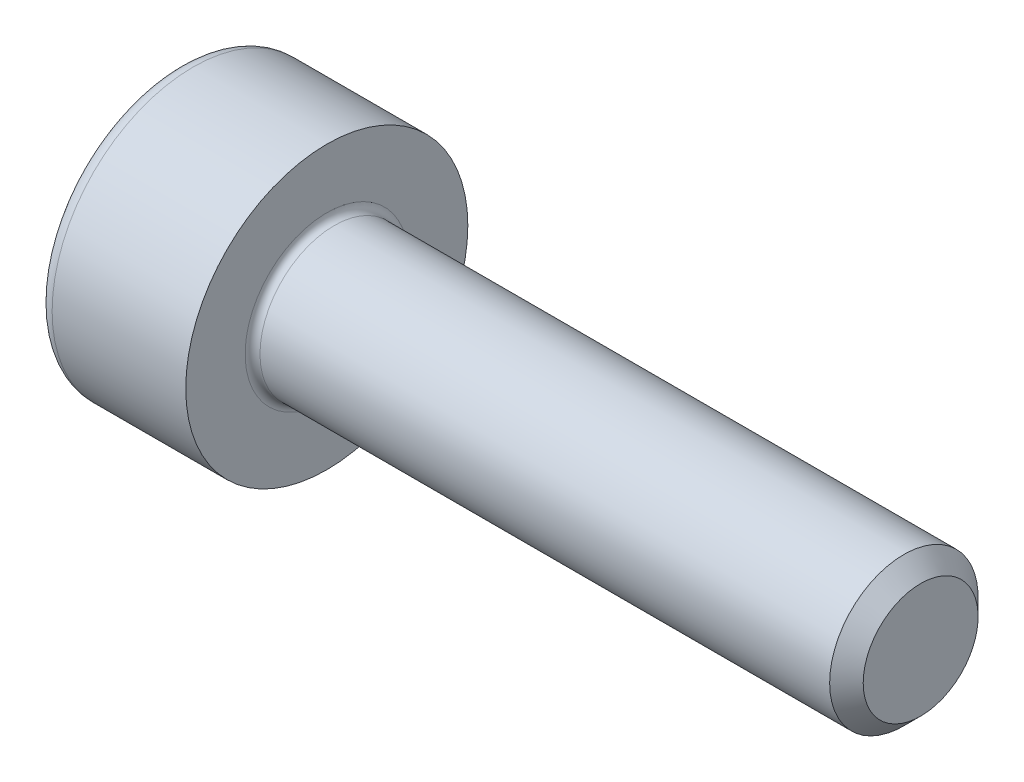
ISO-10303-21;
HEADER;
FILE_DESCRIPTION(('STEP AP214'),'2;1');
FILE_NAME('part.step','',(''),(''),'','','');
FILE_SCHEMA(('AUTOMOTIVE_DESIGN { 1 0 10303 214 1 1 1 1 }'));
ENDSEC;
DATA;
#1=APPLICATION_CONTEXT('core data for automotive mechanical design processes');
#2=APPLICATION_PROTOCOL_DEFINITION('international standard','automotive_design',2000,#1);
#3=PRODUCT_CONTEXT('',#1,'mechanical');
#4=PRODUCT('Part','Part','',(#3));
#5=PRODUCT_RELATED_PRODUCT_CATEGORY('part','',(#4));
#6=PRODUCT_DEFINITION_FORMATION('','',#4);
#7=PRODUCT_DEFINITION_CONTEXT('part definition',#1,'design');
#8=PRODUCT_DEFINITION('design','',#6,#7);
#9=PRODUCT_DEFINITION_SHAPE('','',#8);
#10=(LENGTH_UNIT() NAMED_UNIT(*) SI_UNIT(.MILLI.,.METRE.));
#11=(NAMED_UNIT(*) PLANE_ANGLE_UNIT() SI_UNIT($,.RADIAN.));
#12=(NAMED_UNIT(*) SI_UNIT($,.STERADIAN.) SOLID_ANGLE_UNIT());
#13=UNCERTAINTY_MEASURE_WITH_UNIT(LENGTH_MEASURE(1.E-05),#10,'distance_accuracy_value','');
#14=(GEOMETRIC_REPRESENTATION_CONTEXT(3) GLOBAL_UNCERTAINTY_ASSIGNED_CONTEXT((#13)) GLOBAL_UNIT_ASSIGNED_CONTEXT((#10,
#11,#12)) REPRESENTATION_CONTEXT('',''));
#15=CARTESIAN_POINT('',(0.,0.,0.));
#16=DIRECTION('',(0.,0.,1.));
#17=DIRECTION('',(1.,0.,0.));
#18=AXIS2_PLACEMENT_3D('',#15,#16,#17);
#19=CARTESIAN_POINT('',(0.,0.,0.));
#20=DIRECTION('',(-1.,0.,0.));
#21=DIRECTION('',(0.,0.,1.));
#22=AXIS2_PLACEMENT_3D('',#19,#20,#21);
#23=PLANE('',#22);
#24=DIRECTION('',(0.,-0.499999999999999,0.866025403784439));
#25=VECTOR('',#24,1.);
#26=CARTESIAN_POINT('',(0.,0.877572409168226,0.));
#27=LINE('',#26,#25);
#28=CARTESIAN_POINT('',(0.,0.877572409168226,0.));
#29=VERTEX_POINT('',#28);
#30=CARTESIAN_POINT('',(0.,0.438786204584111,0.759999999999997));
#31=VERTEX_POINT('',#30);
#32=EDGE_CURVE('E265',#29,#31,#27,.T.);
#33=ORIENTED_EDGE('',*,*,#32,.T.);
#34=DIRECTION('',(0.,1.,0.));
#35=VECTOR('',#34,1.);
#36=CARTESIAN_POINT('',(0.,-0.438786204584119,0.759999999999998));
#37=LINE('',#36,#35);
#38=CARTESIAN_POINT('',(0.,-0.438786204584119,0.759999999999998));
#39=VERTEX_POINT('',#38);
#40=EDGE_CURVE('E126',#39,#31,#37,.T.);
#41=ORIENTED_EDGE('',*,*,#40,.F.);
#42=DIRECTION('',(0.,-0.500000000000001,-0.866025403784438));
#43=VECTOR('',#42,1.);
#44=CARTESIAN_POINT('',(0.,-0.438786204584119,0.759999999999998));
#45=LINE('',#44,#43);
#46=CARTESIAN_POINT('',(0.,-0.877572409168236,0.));
#47=VERTEX_POINT('',#46);
#48=EDGE_CURVE('E268',#39,#47,#45,.T.);
#49=ORIENTED_EDGE('',*,*,#48,.T.);
#50=DIRECTION('',(0.,0.499999999999999,-0.866025403784439));
#51=VECTOR('',#50,1.);
#52=CARTESIAN_POINT('',(0.,-0.877572409168236,0.));
#53=LINE('',#52,#51);
#54=CARTESIAN_POINT('',(0.,-0.438786204584121,-0.760000000000002));
#55=VERTEX_POINT('',#54);
#56=EDGE_CURVE('E271',#47,#55,#53,.T.);
#57=ORIENTED_EDGE('',*,*,#56,.T.);
#58=DIRECTION('',(0.,-1.,0.));
#59=VECTOR('',#58,1.);
#60=CARTESIAN_POINT('',(0.,0.438786204584109,-0.760000000000003));
#61=LINE('',#60,#59);
#62=CARTESIAN_POINT('',(0.,0.438786204584109,-0.760000000000003));
#63=VERTEX_POINT('',#62);
#64=EDGE_CURVE('E274',#63,#55,#61,.T.);
#65=ORIENTED_EDGE('',*,*,#64,.F.);
#66=DIRECTION('',(0.,-0.500000000000001,-0.866025403784438));
#67=VECTOR('',#66,1.);
#68=CARTESIAN_POINT('',(0.,0.877572409168226,0.));
#69=LINE('',#68,#67);
#70=EDGE_CURVE('E121',#29,#63,#69,.T.);
#71=ORIENTED_EDGE('',*,*,#70,.F.);
#72=EDGE_LOOP('',(#33,#41,#49,#57,#65,#71));
#73=FACE_BOUND('',#72,.T.);
#74=CARTESIAN_POINT('',(0.,0.,0.));
#75=DIRECTION('',(-1.,0.,0.));
#76=DIRECTION('',(0.,0.,1.));
#77=AXIS2_PLACEMENT_3D('',#74,#75,#76);
#78=CIRCLE('',#77,1.7);
#79=CARTESIAN_POINT('',(0.,0.,1.7));
#80=VERTEX_POINT('',#79);
#81=EDGE_CURVE('E42',#80,#80,#78,.T.);
#82=ORIENTED_EDGE('',*,*,#81,.T.);
#83=EDGE_LOOP('',(#82));
#84=FACE_BOUND('',#83,.T.);
#85=ADVANCED_FACE('F34',(#73,#84),#23,.T.);
#86=CARTESIAN_POINT('',(-31.75,0.,0.));
#87=DIRECTION('',(-1.,0.,0.));
#88=DIRECTION('',(0.,0.,1.));
#89=AXIS2_PLACEMENT_3D('',#86,#87,#88);
#90=CYLINDRICAL_SURFACE('',#89,1.9);
#91=CARTESIAN_POINT('',(0.199999999999999,0.,0.));
#92=DIRECTION('',(-1.,0.,0.));
#93=DIRECTION('',(0.,0.,1.));
#94=AXIS2_PLACEMENT_3D('',#91,#92,#93);
#95=CIRCLE('',#94,1.9);
#96=CARTESIAN_POINT('',(0.199999999999999,0.,1.9));
#97=VERTEX_POINT('',#96);
#98=EDGE_CURVE('E11',#97,#97,#95,.F.);
#99=ORIENTED_EDGE('',*,*,#98,.T.);
#100=EDGE_LOOP('',(#99));
#101=FACE_BOUND('',#100,.T.);
#102=CARTESIAN_POINT('',(2.,0.,0.));
#103=DIRECTION('',(-1.,0.,0.));
#104=DIRECTION('',(0.,0.,1.));
#105=AXIS2_PLACEMENT_3D('',#102,#103,#104);
#106=CIRCLE('',#105,1.9);
#107=CARTESIAN_POINT('',(2.,0.,1.9));
#108=VERTEX_POINT('',#107);
#109=EDGE_CURVE('E144',#108,#108,#106,.T.);
#110=ORIENTED_EDGE('',*,*,#109,.T.);
#111=EDGE_LOOP('',(#110));
#112=FACE_BOUND('',#111,.T.);
#113=ADVANCED_FACE('F168',(#101,#112),#90,.T.);
#114=CARTESIAN_POINT('',(2.,1.9,0.));
#115=DIRECTION('',(1.,0.,0.));
#116=DIRECTION('',(0.,0.,-1.));
#117=AXIS2_PLACEMENT_3D('',#114,#115,#116);
#118=PLANE('',#117);
#119=CARTESIAN_POINT('',(2.,0.,0.));
#120=DIRECTION('',(1.,0.,0.));
#121=DIRECTION('',(0.,0.,-1.));
#122=AXIS2_PLACEMENT_3D('',#119,#120,#121);
#123=CIRCLE('',#122,1.1);
#124=CARTESIAN_POINT('',(2.,0.,-1.1));
#125=VERTEX_POINT('',#124);
#126=EDGE_CURVE('E147',#125,#125,#123,.F.);
#127=ORIENTED_EDGE('',*,*,#126,.T.);
#128=EDGE_LOOP('',(#127));
#129=FACE_BOUND('',#128,.T.);
#130=ORIENTED_EDGE('',*,*,#109,.F.);
#131=EDGE_LOOP('',(#130));
#132=FACE_BOUND('',#131,.T.);
#133=ADVANCED_FACE('F174',(#129,#132),#118,.T.);
#134=CARTESIAN_POINT('',(-31.75,0.,0.));
#135=DIRECTION('',(-1.,0.,0.));
#136=DIRECTION('',(0.,0.,1.));
#137=AXIS2_PLACEMENT_3D('',#134,#135,#136);
#138=CYLINDRICAL_SURFACE('',#137,1.);
#139=CARTESIAN_POINT('',(2.1,0.,0.));
#140=DIRECTION('',(1.,0.,0.));
#141=DIRECTION('',(0.,0.,-1.));
#142=AXIS2_PLACEMENT_3D('',#139,#140,#141);
#143=CIRCLE('',#142,1.);
#144=CARTESIAN_POINT('',(2.1,0.,-1.));
#145=VERTEX_POINT('',#144);
#146=EDGE_CURVE('E150',#145,#145,#143,.T.);
#147=ORIENTED_EDGE('',*,*,#146,.T.);
#148=EDGE_LOOP('',(#147));
#149=FACE_BOUND('',#148,.T.);
#150=CARTESIAN_POINT('',(9.774,0.,0.));
#151=DIRECTION('',(-1.,0.,0.));
#152=DIRECTION('',(0.,0.,1.));
#153=AXIS2_PLACEMENT_3D('',#150,#151,#152);
#154=CIRCLE('',#153,1.);
#155=CARTESIAN_POINT('',(9.774,0.,1.));
#156=VERTEX_POINT('',#155);
#157=EDGE_CURVE('E141',#156,#156,#154,.T.);
#158=ORIENTED_EDGE('',*,*,#157,.T.);
#159=EDGE_LOOP('',(#158));
#160=FACE_BOUND('',#159,.T.);
#161=ADVANCED_FACE('F180',(#149,#160),#138,.T.);
#162=CARTESIAN_POINT('',(10.,0.,0.));
#163=DIRECTION('',(-1.,0.,0.));
#164=DIRECTION('',(0.,0.,1.));
#165=AXIS2_PLACEMENT_3D('',#162,#163,#164);
#166=CONICAL_SURFACE('',#165,0.774,0.785398163397454);
#167=ORIENTED_EDGE('',*,*,#157,.F.);
#168=EDGE_LOOP('',(#167));
#169=FACE_BOUND('',#168,.T.);
#170=CARTESIAN_POINT('',(10.,0.,0.));
#171=DIRECTION('',(-1.,0.,0.));
#172=DIRECTION('',(0.,0.,1.));
#173=AXIS2_PLACEMENT_3D('',#170,#171,#172);
#174=CIRCLE('',#173,0.774);
#175=CARTESIAN_POINT('',(10.,0.,0.774));
#176=VERTEX_POINT('',#175);
#177=EDGE_CURVE('E137',#176,#176,#174,.T.);
#178=ORIENTED_EDGE('',*,*,#177,.T.);
#179=EDGE_LOOP('',(#178));
#180=FACE_BOUND('',#179,.T.);
#181=ADVANCED_FACE('F184',(#169,#180),#166,.T.);
#182=CARTESIAN_POINT('',(10.,0.774,0.));
#183=DIRECTION('',(1.,0.,0.));
#184=DIRECTION('',(0.,0.,-1.));
#185=AXIS2_PLACEMENT_3D('',#182,#183,#184);
#186=PLANE('',#185);
#187=ORIENTED_EDGE('',*,*,#177,.F.);
#188=EDGE_LOOP('',(#187));
#189=FACE_BOUND('',#188,.T.);
#190=ADVANCED_FACE('F164',(#189),#186,.T.);
#191=CARTESIAN_POINT('',(2.1,0.,0.));
#192=DIRECTION('',(1.,0.,0.));
#193=DIRECTION('',(0.,0.,-1.));
#194=AXIS2_PLACEMENT_3D('',#191,#192,#193);
#195=TOROIDAL_SURFACE('',#194,1.1,0.1);
#196=ORIENTED_EDGE('',*,*,#146,.F.);
#197=EDGE_LOOP('',(#196));
#198=FACE_BOUND('',#197,.T.);
#199=ORIENTED_EDGE('',*,*,#126,.F.);
#200=EDGE_LOOP('',(#199));
#201=FACE_BOUND('',#200,.T.);
#202=ADVANCED_FACE('F157',(#198,#201),#195,.F.);
#203=CARTESIAN_POINT('',(0.199999999999999,0.,0.));
#204=DIRECTION('',(-1.,0.,0.));
#205=DIRECTION('',(0.,0.,1.));
#206=AXIS2_PLACEMENT_3D('',#203,#204,#205);
#207=TOROIDAL_SURFACE('',#206,1.7,0.2);
#208=ORIENTED_EDGE('',*,*,#98,.F.);
#209=EDGE_LOOP('',(#208));
#210=FACE_BOUND('',#209,.T.);
#211=ORIENTED_EDGE('',*,*,#81,.F.);
#212=EDGE_LOOP('',(#211));
#213=FACE_BOUND('',#212,.T.);
#214=ADVANCED_FACE('F36',(#210,#213),#207,.T.);
#215=CARTESIAN_POINT('',(1.,0.877572409168226,0.));
#216=DIRECTION('',(0.,-0.866025403784439,-0.499999999999999));
#217=DIRECTION('',(0.,0.499999999999999,-0.866025403784439));
#218=AXIS2_PLACEMENT_3D('',#215,#216,#217);
#219=PLANE('',#218);
#220=ORIENTED_EDGE('',*,*,#32,.F.);
#221=DIRECTION('',(-1.,0.,0.));
#222=VECTOR('',#221,1.);
#223=CARTESIAN_POINT('',(1.,0.877572409168226,0.));
#224=LINE('',#223,#222);
#225=CARTESIAN_POINT('',(1.,0.877572409168226,0.));
#226=VERTEX_POINT('',#225);
#227=EDGE_CURVE('E264',#226,#29,#224,.T.);
#228=ORIENTED_EDGE('',*,*,#227,.F.);
#229=DIRECTION('',(0.,-0.499999999999999,0.866025403784439));
#230=VECTOR('',#229,1.);
#231=CARTESIAN_POINT('',(1.,0.877572409168226,0.));
#232=LINE('',#231,#230);
#233=CARTESIAN_POINT('',(1.,0.658179306876174,0.379999999999999));
#234=VERTEX_POINT('',#233);
#235=EDGE_CURVE('E49',#226,#234,#232,.T.);
#236=ORIENTED_EDGE('',*,*,#235,.T.);
#237=CARTESIAN_POINT('',(1.,0.438786204584111,0.759999999999997));
#238=VERTEX_POINT('',#237);
#239=EDGE_CURVE('E107',#234,#238,#232,.T.);
#240=ORIENTED_EDGE('',*,*,#239,.T.);
#241=DIRECTION('',(-1.,0.,0.));
#242=VECTOR('',#241,1.);
#243=CARTESIAN_POINT('',(1.,0.438786204584111,0.759999999999997));
#244=LINE('',#243,#242);
#245=EDGE_CURVE('E119',#238,#31,#244,.T.);
#246=ORIENTED_EDGE('',*,*,#245,.T.);
#247=EDGE_LOOP('',(#220,#228,#236,#240,#246));
#248=FACE_BOUND('',#247,.T.);
#249=ADVANCED_FACE('F118',(#248),#219,.T.);
#250=CARTESIAN_POINT('',(1.,-0.438786204584119,0.759999999999998));
#251=DIRECTION('',(0.,0.,1.));
#252=DIRECTION('',(0.,-1.,0.));
#253=AXIS2_PLACEMENT_3D('',#250,#251,#252);
#254=PLANE('',#253);
#255=ORIENTED_EDGE('',*,*,#40,.T.);
#256=ORIENTED_EDGE('',*,*,#245,.F.);
#257=DIRECTION('',(0.,1.,0.));
#258=VECTOR('',#257,1.);
#259=CARTESIAN_POINT('',(1.,-0.438786204584119,0.759999999999998));
#260=LINE('',#259,#258);
#261=CARTESIAN_POINT('',(1.,0.,0.759999999999997));
#262=VERTEX_POINT('',#261);
#263=EDGE_CURVE('E105',#262,#238,#260,.T.);
#264=ORIENTED_EDGE('',*,*,#263,.F.);
#265=CARTESIAN_POINT('',(1.,-0.438786204584119,0.759999999999998));
#266=VERTEX_POINT('',#265);
#267=EDGE_CURVE('E115',#266,#262,#260,.T.);
#268=ORIENTED_EDGE('',*,*,#267,.F.);
#269=DIRECTION('',(-1.,0.,0.));
#270=VECTOR('',#269,1.);
#271=CARTESIAN_POINT('',(1.,-0.438786204584119,0.759999999999998));
#272=LINE('',#271,#270);
#273=EDGE_CURVE('E128',#266,#39,#272,.T.);
#274=ORIENTED_EDGE('',*,*,#273,.T.);
#275=EDGE_LOOP('',(#255,#256,#264,#268,#274));
#276=FACE_BOUND('',#275,.T.);
#277=ADVANCED_FACE('F123',(#276),#254,.F.);
#278=CARTESIAN_POINT('',(1.,-0.438786204584119,0.759999999999998));
#279=DIRECTION('',(0.,0.866025403784438,-0.500000000000001));
#280=DIRECTION('',(0.,0.500000000000001,0.866025403784438));
#281=AXIS2_PLACEMENT_3D('',#278,#279,#280);
#282=PLANE('',#281);
#283=ORIENTED_EDGE('',*,*,#48,.F.);
#284=ORIENTED_EDGE('',*,*,#273,.F.);
#285=DIRECTION('',(0.,-0.500000000000001,-0.866025403784438));
#286=VECTOR('',#285,1.);
#287=CARTESIAN_POINT('',(1.,-0.438786204584119,0.759999999999998));
#288=LINE('',#287,#286);
#289=CARTESIAN_POINT('',(1.,-0.658179306876175,0.380000000000002));
#290=VERTEX_POINT('',#289);
#291=EDGE_CURVE('E245',#266,#290,#288,.T.);
#292=ORIENTED_EDGE('',*,*,#291,.T.);
#293=CARTESIAN_POINT('',(1.,-0.877572409168236,0.));
#294=VERTEX_POINT('',#293);
#295=EDGE_CURVE('E247',#290,#294,#288,.T.);
#296=ORIENTED_EDGE('',*,*,#295,.T.);
#297=DIRECTION('',(-1.,0.,0.));
#298=VECTOR('',#297,1.);
#299=CARTESIAN_POINT('',(1.,-0.877572409168236,0.));
#300=LINE('',#299,#298);
#301=EDGE_CURVE('E133',#294,#47,#300,.T.);
#302=ORIENTED_EDGE('',*,*,#301,.T.);
#303=EDGE_LOOP('',(#283,#284,#292,#296,#302));
#304=FACE_BOUND('',#303,.T.);
#305=ADVANCED_FACE('F197',(#304),#282,.T.);
#306=CARTESIAN_POINT('',(1.,-0.877572409168236,0.));
#307=DIRECTION('',(0.,0.866025403784439,0.499999999999999));
#308=DIRECTION('',(0.,-0.499999999999999,0.866025403784439));
#309=AXIS2_PLACEMENT_3D('',#306,#307,#308);
#310=PLANE('',#309);
#311=ORIENTED_EDGE('',*,*,#56,.F.);
#312=ORIENTED_EDGE('',*,*,#301,.F.);
#313=DIRECTION('',(0.,0.499999999999999,-0.866025403784439));
#314=VECTOR('',#313,1.);
#315=CARTESIAN_POINT('',(1.,-0.877572409168236,0.));
#316=LINE('',#315,#314);
#317=CARTESIAN_POINT('',(1.,-0.658179306876178,-0.380000000000001));
#318=VERTEX_POINT('',#317);
#319=EDGE_CURVE('E250',#294,#318,#316,.T.);
#320=ORIENTED_EDGE('',*,*,#319,.T.);
#321=CARTESIAN_POINT('',(1.,-0.438786204584121,-0.760000000000002));
#322=VERTEX_POINT('',#321);
#323=EDGE_CURVE('E254',#318,#322,#316,.T.);
#324=ORIENTED_EDGE('',*,*,#323,.T.);
#325=DIRECTION('',(-1.,0.,0.));
#326=VECTOR('',#325,1.);
#327=CARTESIAN_POINT('',(1.,-0.438786204584121,-0.760000000000002));
#328=LINE('',#327,#326);
#329=EDGE_CURVE('E283',#322,#55,#328,.T.);
#330=ORIENTED_EDGE('',*,*,#329,.T.);
#331=EDGE_LOOP('',(#311,#312,#320,#324,#330));
#332=FACE_BOUND('',#331,.T.);
#333=ADVANCED_FACE('F200',(#332),#310,.T.);
#334=CARTESIAN_POINT('',(1.,0.438786204584109,-0.760000000000003));
#335=DIRECTION('',(0.,0.,-1.));
#336=DIRECTION('',(0.,1.,0.));
#337=AXIS2_PLACEMENT_3D('',#334,#335,#336);
#338=PLANE('',#337);
#339=ORIENTED_EDGE('',*,*,#64,.T.);
#340=ORIENTED_EDGE('',*,*,#329,.F.);
#341=DIRECTION('',(0.,-1.,0.));
#342=VECTOR('',#341,1.);
#343=CARTESIAN_POINT('',(1.,0.438786204584109,-0.760000000000003));
#344=LINE('',#343,#342);
#345=CARTESIAN_POINT('',(1.,0.,-0.760000000000002));
#346=VERTEX_POINT('',#345);
#347=EDGE_CURVE('E258',#346,#322,#344,.T.);
#348=ORIENTED_EDGE('',*,*,#347,.F.);
#349=CARTESIAN_POINT('',(1.,0.438786204584109,-0.760000000000003));
#350=VERTEX_POINT('',#349);
#351=EDGE_CURVE('E259',#350,#346,#344,.T.);
#352=ORIENTED_EDGE('',*,*,#351,.F.);
#353=DIRECTION('',(-1.,0.,0.));
#354=VECTOR('',#353,1.);
#355=CARTESIAN_POINT('',(1.,0.438786204584109,-0.760000000000003));
#356=LINE('',#355,#354);
#357=EDGE_CURVE('E280',#350,#63,#356,.T.);
#358=ORIENTED_EDGE('',*,*,#357,.T.);
#359=EDGE_LOOP('',(#339,#340,#348,#352,#358));
#360=FACE_BOUND('',#359,.T.);
#361=ADVANCED_FACE('F204',(#360),#338,.F.);
#362=CARTESIAN_POINT('',(1.,0.877572409168226,0.));
#363=DIRECTION('',(0.,0.866025403784438,-0.500000000000001));
#364=DIRECTION('',(0.,0.500000000000001,0.866025403784438));
#365=AXIS2_PLACEMENT_3D('',#362,#363,#364);
#366=PLANE('',#365);
#367=ORIENTED_EDGE('',*,*,#70,.T.);
#368=ORIENTED_EDGE('',*,*,#357,.F.);
#369=DIRECTION('',(0.,-0.500000000000001,-0.866025403784438));
#370=VECTOR('',#369,1.);
#371=CARTESIAN_POINT('',(1.,0.877572409168226,0.));
#372=LINE('',#371,#370);
#373=CARTESIAN_POINT('',(1.,0.65817930687617,-0.379999999999999));
#374=VERTEX_POINT('',#373);
#375=EDGE_CURVE('E262',#374,#350,#372,.T.);
#376=ORIENTED_EDGE('',*,*,#375,.F.);
#377=EDGE_CURVE('E236',#226,#374,#372,.T.);
#378=ORIENTED_EDGE('',*,*,#377,.F.);
#379=ORIENTED_EDGE('',*,*,#227,.T.);
#380=EDGE_LOOP('',(#367,#368,#376,#378,#379));
#381=FACE_BOUND('',#380,.T.);
#382=ADVANCED_FACE('F208',(#381),#366,.F.);
#383=CARTESIAN_POINT('',(1.,0.438786204584111,0.759999999999997));
#384=DIRECTION('',(-1.,0.,0.));
#385=DIRECTION('',(0.,0.,1.));
#386=AXIS2_PLACEMENT_3D('',#383,#384,#385);
#387=PLANE('',#386);
#388=CARTESIAN_POINT('',(1.,0.,0.));
#389=DIRECTION('',(-1.,0.,0.));
#390=DIRECTION('',(0.,0.,1.));
#391=AXIS2_PLACEMENT_3D('',#388,#389,#390);
#392=CIRCLE('',#391,0.76);
#393=EDGE_CURVE('E127',#290,#262,#392,.T.);
#394=ORIENTED_EDGE('',*,*,#393,.F.);
#395=ORIENTED_EDGE('',*,*,#291,.F.);
#396=ORIENTED_EDGE('',*,*,#267,.T.);
#397=EDGE_LOOP('',(#394,#395,#396));
#398=FACE_BOUND('',#397,.T.);
#399=ADVANCED_FACE('F212',(#398),#387,.T.);
#400=EDGE_CURVE('E131',#318,#290,#392,.T.);
#401=ORIENTED_EDGE('',*,*,#400,.F.);
#402=ORIENTED_EDGE('',*,*,#319,.F.);
#403=ORIENTED_EDGE('',*,*,#295,.F.);
#404=EDGE_LOOP('',(#401,#402,#403));
#405=FACE_BOUND('',#404,.T.);
#406=ADVANCED_FACE('F215',(#405),#387,.T.);
#407=EDGE_CURVE('E289',#346,#318,#392,.T.);
#408=ORIENTED_EDGE('',*,*,#407,.F.);
#409=ORIENTED_EDGE('',*,*,#347,.T.);
#410=ORIENTED_EDGE('',*,*,#323,.F.);
#411=EDGE_LOOP('',(#408,#409,#410));
#412=FACE_BOUND('',#411,.T.);
#413=ADVANCED_FACE('F220',(#412),#387,.T.);
#414=EDGE_CURVE('E239',#374,#346,#392,.T.);
#415=ORIENTED_EDGE('',*,*,#414,.F.);
#416=ORIENTED_EDGE('',*,*,#375,.T.);
#417=ORIENTED_EDGE('',*,*,#351,.T.);
#418=EDGE_LOOP('',(#415,#416,#417));
#419=FACE_BOUND('',#418,.T.);
#420=ADVANCED_FACE('F227',(#419),#387,.T.);
#421=EDGE_CURVE('E138',#234,#374,#392,.T.);
#422=ORIENTED_EDGE('',*,*,#421,.F.);
#423=ORIENTED_EDGE('',*,*,#235,.F.);
#424=ORIENTED_EDGE('',*,*,#377,.T.);
#425=EDGE_LOOP('',(#422,#423,#424));
#426=FACE_BOUND('',#425,.T.);
#427=ADVANCED_FACE('F223',(#426),#387,.T.);
#428=EDGE_CURVE('E110',#262,#234,#392,.T.);
#429=ORIENTED_EDGE('',*,*,#428,.F.);
#430=ORIENTED_EDGE('',*,*,#263,.T.);
#431=ORIENTED_EDGE('',*,*,#239,.F.);
#432=EDGE_LOOP('',(#429,#430,#431));
#433=FACE_BOUND('',#432,.T.);
#434=ADVANCED_FACE('F106',(#433),#387,.T.);
#435=CARTESIAN_POINT('',(1.,0.,0.));
#436=DIRECTION('',(-1.,0.,0.));
#437=DIRECTION('',(0.,0.,1.));
#438=AXIS2_PLACEMENT_3D('',#435,#436,#437);
#439=CONICAL_SURFACE('',#438,0.76,1.0471975511966);
#440=CARTESIAN_POINT('',(1.43878620458412,0.,0.));
#441=VERTEX_POINT('',#440);
#442=VERTEX_LOOP('',#441);
#443=FACE_BOUND('',#442,.T.);
#444=ORIENTED_EDGE('',*,*,#428,.T.);
#445=ORIENTED_EDGE('',*,*,#421,.T.);
#446=ORIENTED_EDGE('',*,*,#414,.T.);
#447=ORIENTED_EDGE('',*,*,#407,.T.);
#448=ORIENTED_EDGE('',*,*,#400,.T.);
#449=ORIENTED_EDGE('',*,*,#393,.T.);
#450=EDGE_LOOP('',(#444,#445,#446,#447,#448,#449));
#451=FACE_BOUND('',#450,.T.);
#452=ADVANCED_FACE('F192',(#443,#451),#439,.F.);
#453=CLOSED_SHELL('',(#85,#113,#133,#161,#181,#190,#202,#214,#249,#277,#305,#333,#361,#382,#399,
#406,#413,#420,#427,#434,#452));
#454=MANIFOLD_SOLID_BREP('B2',#453);
#455=ADVANCED_BREP_SHAPE_REPRESENTATION('',(#18,#454),#14);
#456=SHAPE_DEFINITION_REPRESENTATION(#9,#455);
ENDSEC;
END-ISO-10303-21;
